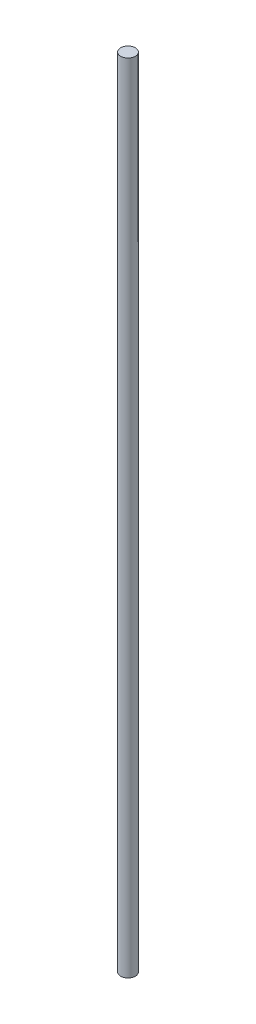
ISO-10303-21;
HEADER;
FILE_DESCRIPTION(('STEP AP214'),'2;1');
FILE_NAME('part.step','',(''),(''),'','','');
FILE_SCHEMA(('AUTOMOTIVE_DESIGN { 1 0 10303 214 1 1 1 1 }'));
ENDSEC;
DATA;
#1=APPLICATION_CONTEXT('core data for automotive mechanical design processes');
#2=APPLICATION_PROTOCOL_DEFINITION('international standard','automotive_design',2000,#1);
#3=PRODUCT_CONTEXT('',#1,'mechanical');
#4=PRODUCT('Part','Part','',(#3));
#5=PRODUCT_RELATED_PRODUCT_CATEGORY('part','',(#4));
#6=PRODUCT_DEFINITION_FORMATION('','',#4);
#7=PRODUCT_DEFINITION_CONTEXT('part definition',#1,'design');
#8=PRODUCT_DEFINITION('design','',#6,#7);
#9=PRODUCT_DEFINITION_SHAPE('','',#8);
#10=(LENGTH_UNIT() NAMED_UNIT(*) SI_UNIT(.MILLI.,.METRE.));
#11=(NAMED_UNIT(*) PLANE_ANGLE_UNIT() SI_UNIT($,.RADIAN.));
#12=(NAMED_UNIT(*) SI_UNIT($,.STERADIAN.) SOLID_ANGLE_UNIT());
#13=UNCERTAINTY_MEASURE_WITH_UNIT(LENGTH_MEASURE(1.E-05),#10,'distance_accuracy_value','');
#14=(GEOMETRIC_REPRESENTATION_CONTEXT(3) GLOBAL_UNCERTAINTY_ASSIGNED_CONTEXT((#13)) GLOBAL_UNIT_ASSIGNED_CONTEXT((#10,
#11,#12)) REPRESENTATION_CONTEXT('',''));
#15=CARTESIAN_POINT('',(0.,0.,0.));
#16=DIRECTION('',(0.,0.,1.));
#17=DIRECTION('',(1.,0.,0.));
#18=AXIS2_PLACEMENT_3D('',#15,#16,#17);
#19=CARTESIAN_POINT('',(0.,324.5,0.));
#20=DIRECTION('',(0.,-1.,0.));
#21=DIRECTION('',(0.,0.,-1.));
#22=AXIS2_PLACEMENT_3D('',#19,#20,#21);
#23=CYLINDRICAL_SURFACE('',#22,3.);
#24=CARTESIAN_POINT('',(0.,324.5,0.));
#25=DIRECTION('',(0.,1.,0.));
#26=DIRECTION('',(0.,0.,1.));
#27=AXIS2_PLACEMENT_3D('',#24,#25,#26);
#28=CIRCLE('',#27,3.);
#29=CARTESIAN_POINT('',(0.,324.5,-3.));
#30=VERTEX_POINT('',#29);
#31=EDGE_CURVE('E10',#30,#30,#28,.T.);
#32=CARTESIAN_POINT('',(0.,0.,0.));
#33=DIRECTION('',(0.,1.,0.));
#34=DIRECTION('',(0.,0.,1.));
#35=AXIS2_PLACEMENT_3D('',#32,#33,#34);
#36=CIRCLE('',#35,3.);
#37=CARTESIAN_POINT('',(0.,0.,-3.));
#38=VERTEX_POINT('',#37);
#39=EDGE_CURVE('E42',#38,#38,#36,.T.);
#40=CARTESIAN_POINT('',(0.,324.5,-3.));
#41=CARTESIAN_POINT('',(0.,321.119791666667,-3.));
#42=CARTESIAN_POINT('',(0.,317.739583333333,-3.));
#43=CARTESIAN_POINT('',(0.,310.979166666667,-3.));
#44=CARTESIAN_POINT('',(0.,307.598958333333,-3.));
#45=CARTESIAN_POINT('',(0.,300.838541666667,-3.));
#46=CARTESIAN_POINT('',(0.,297.458333333333,-3.));
#47=CARTESIAN_POINT('',(0.,290.697916666667,-3.));
#48=CARTESIAN_POINT('',(0.,287.317708333333,-3.));
#49=CARTESIAN_POINT('',(0.,280.557291666667,-3.));
#50=CARTESIAN_POINT('',(0.,277.177083333333,-3.));
#51=CARTESIAN_POINT('',(0.,270.416666666667,-3.));
#52=CARTESIAN_POINT('',(0.,267.036458333333,-3.));
#53=CARTESIAN_POINT('',(0.,260.276041666667,-3.));
#54=CARTESIAN_POINT('',(0.,256.895833333333,-3.));
#55=CARTESIAN_POINT('',(0.,250.135416666667,-3.));
#56=CARTESIAN_POINT('',(0.,246.755208333333,-3.));
#57=CARTESIAN_POINT('',(0.,239.994791666667,-3.));
#58=CARTESIAN_POINT('',(0.,236.614583333333,-3.));
#59=CARTESIAN_POINT('',(0.,229.854166666667,-3.));
#60=CARTESIAN_POINT('',(0.,226.473958333333,-3.));
#61=CARTESIAN_POINT('',(0.,219.713541666667,-3.));
#62=CARTESIAN_POINT('',(0.,216.333333333333,-3.));
#63=CARTESIAN_POINT('',(0.,209.572916666667,-3.));
#64=CARTESIAN_POINT('',(0.,206.192708333333,-3.));
#65=CARTESIAN_POINT('',(0.,199.432291666667,-3.));
#66=CARTESIAN_POINT('',(0.,196.052083333333,-3.));
#67=CARTESIAN_POINT('',(0.,189.291666666667,-3.));
#68=CARTESIAN_POINT('',(0.,185.911458333333,-3.));
#69=CARTESIAN_POINT('',(0.,179.151041666667,-3.));
#70=CARTESIAN_POINT('',(0.,175.770833333333,-3.));
#71=CARTESIAN_POINT('',(0.,169.010416666667,-3.));
#72=CARTESIAN_POINT('',(0.,165.630208333333,-3.));
#73=CARTESIAN_POINT('',(0.,158.869791666667,-3.));
#74=CARTESIAN_POINT('',(0.,155.489583333333,-3.));
#75=CARTESIAN_POINT('',(0.,148.729166666667,-3.));
#76=CARTESIAN_POINT('',(0.,145.348958333333,-3.));
#77=CARTESIAN_POINT('',(0.,138.588541666667,-3.));
#78=CARTESIAN_POINT('',(0.,135.208333333333,-3.));
#79=CARTESIAN_POINT('',(0.,128.447916666667,-3.));
#80=CARTESIAN_POINT('',(0.,125.067708333333,-3.));
#81=CARTESIAN_POINT('',(0.,118.307291666667,-3.));
#82=CARTESIAN_POINT('',(0.,114.927083333333,-3.));
#83=CARTESIAN_POINT('',(0.,108.166666666667,-3.));
#84=CARTESIAN_POINT('',(0.,104.786458333333,-3.));
#85=CARTESIAN_POINT('',(0.,98.0260416666666,-3.));
#86=CARTESIAN_POINT('',(0.,94.6458333333333,-3.));
#87=CARTESIAN_POINT('',(0.,87.8854166666666,-3.));
#88=CARTESIAN_POINT('',(0.,84.5052083333333,-3.));
#89=CARTESIAN_POINT('',(0.,77.7447916666666,-3.));
#90=CARTESIAN_POINT('',(0.,74.3645833333333,-3.));
#91=CARTESIAN_POINT('',(0.,67.6041666666666,-3.));
#92=CARTESIAN_POINT('',(0.,64.2239583333333,-3.));
#93=CARTESIAN_POINT('',(0.,57.4635416666666,-3.));
#94=CARTESIAN_POINT('',(0.,54.0833333333333,-3.));
#95=CARTESIAN_POINT('',(0.,47.3229166666666,-3.));
#96=CARTESIAN_POINT('',(0.,43.9427083333333,-3.));
#97=CARTESIAN_POINT('',(0.,37.1822916666666,-3.));
#98=CARTESIAN_POINT('',(0.,33.8020833333333,-3.));
#99=CARTESIAN_POINT('',(0.,27.0416666666666,-3.));
#100=CARTESIAN_POINT('',(0.,23.6614583333333,-3.));
#101=CARTESIAN_POINT('',(0.,16.9010416666666,-3.));
#102=CARTESIAN_POINT('',(0.,13.5208333333333,-3.));
#103=CARTESIAN_POINT('',(0.,6.76041666666662,-3.));
#104=CARTESIAN_POINT('',(0.,3.38020833333328,-3.));
#105=CARTESIAN_POINT('',(0.,0.,-3.));
#106=B_SPLINE_CURVE_WITH_KNOTS('',3,(#40,#41,#42,#43,#44,#45,#46,#47,#48,#49,#50,#51,#52,#53,
#54,#55,#56,#57,#58,#59,#60,#61,#62,#63,#64,#65,#66,#67,#68,#69,#70,#71,#72,#73,#74,#75,#76,#77,
#78,#79,#80,#81,#82,#83,#84,#85,#86,#87,#88,#89,#90,#91,#92,#93,#94,#95,#96,#97,#98,#99,#100,
#101,#102,#103,#104,#105),.UNSPECIFIED.,.F.,.F.,(4,2,2,2,2,2,2,2,2,2,2,2,2,2,2,2,2,2,2,2,2,2,2,
2,2,2,2,2,2,2,2,2,4),(0.,10.140625,20.28125,30.421875,40.5625000000001,50.703125,60.84375,
70.984375,81.1250000000001,91.265625,101.40625,111.546875,121.6875,131.828125,141.96875,
152.109375,162.25,172.390625,182.53125,192.671875,202.8125,212.953125,223.09375,233.234375,
243.375,253.515625,263.65625,273.796875,283.9375,294.078125,304.21875,314.359375,324.5),.UNSPECIFIED.);
#107=EDGE_CURVE('BSEAM39',#30,#38,#106,.T.);
#108=ORIENTED_EDGE('',*,*,#31,.F.);
#109=ORIENTED_EDGE('',*,*,#39,.T.);
#110=ORIENTED_EDGE('',*,*,#107,.T.);
#111=ORIENTED_EDGE('',*,*,#107,.F.);
#112=EDGE_LOOP('',(#108,#110,#109,#111));
#113=FACE_BOUND('',#112,.T.);
#114=ADVANCED_FACE('F39',(#113),#23,.T.);
#115=CARTESIAN_POINT('',(0.,324.5,0.));
#116=DIRECTION('',(0.,1.,0.));
#117=DIRECTION('',(0.,0.,1.));
#118=AXIS2_PLACEMENT_3D('',#115,#116,#117);
#119=PLANE('',#118);
#120=ORIENTED_EDGE('',*,*,#31,.T.);
#121=EDGE_LOOP('',(#120));
#122=FACE_BOUND('',#121,.T.);
#123=ADVANCED_FACE('F56',(#122),#119,.T.);
#124=CARTESIAN_POINT('',(0.,0.,0.));
#125=DIRECTION('',(0.,1.,0.));
#126=DIRECTION('',(0.,0.,1.));
#127=AXIS2_PLACEMENT_3D('',#124,#125,#126);
#128=PLANE('',#127);
#129=ORIENTED_EDGE('',*,*,#39,.F.);
#130=EDGE_LOOP('',(#129));
#131=FACE_BOUND('',#130,.T.);
#132=ADVANCED_FACE('F54',(#131),#128,.F.);
#133=CLOSED_SHELL('',(#114,#123,#132));
#134=MANIFOLD_SOLID_BREP('B2',#133);
#135=ADVANCED_BREP_SHAPE_REPRESENTATION('',(#18,#134),#14);
#136=SHAPE_DEFINITION_REPRESENTATION(#9,#135);
ENDSEC;
END-ISO-10303-21;
